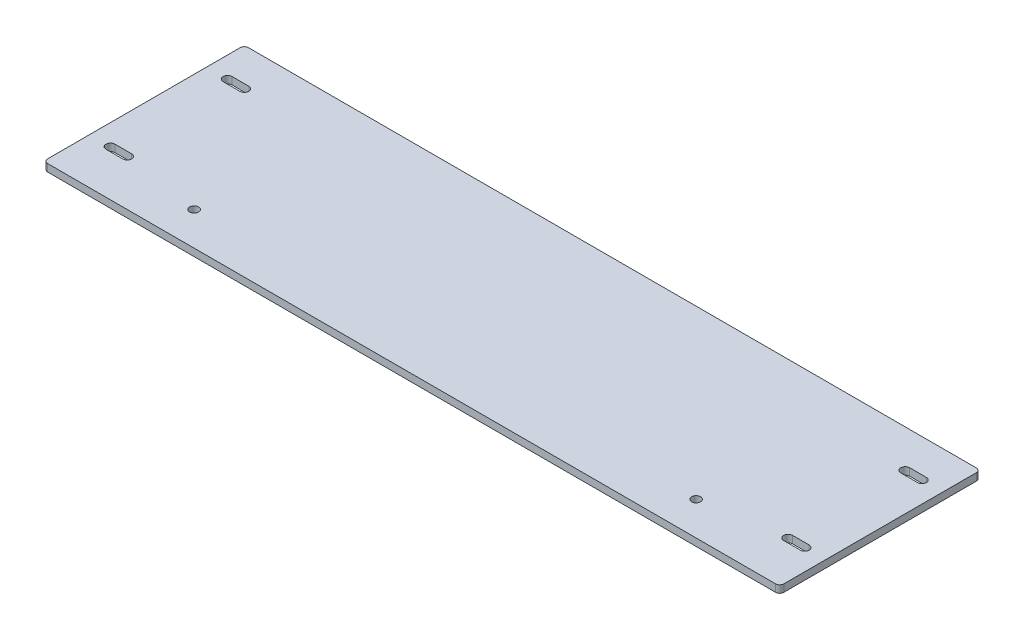
ISO-10303-21;
HEADER;
FILE_DESCRIPTION(('STEP AP214'),'2;1');
FILE_NAME('part.step','',(''),(''),'','','');
FILE_SCHEMA(('AUTOMOTIVE_DESIGN { 1 0 10303 214 1 1 1 1 }'));
ENDSEC;
DATA;
#1=APPLICATION_CONTEXT('core data for automotive mechanical design processes');
#2=APPLICATION_PROTOCOL_DEFINITION('international standard','automotive_design',2000,#1);
#3=PRODUCT_CONTEXT('',#1,'mechanical');
#4=PRODUCT('Part','Part','',(#3));
#5=PRODUCT_RELATED_PRODUCT_CATEGORY('part','',(#4));
#6=PRODUCT_DEFINITION_FORMATION('','',#4);
#7=PRODUCT_DEFINITION_CONTEXT('part definition',#1,'design');
#8=PRODUCT_DEFINITION('design','',#6,#7);
#9=PRODUCT_DEFINITION_SHAPE('','',#8);
#10=(LENGTH_UNIT() NAMED_UNIT(*) SI_UNIT(.MILLI.,.METRE.));
#11=(NAMED_UNIT(*) PLANE_ANGLE_UNIT() SI_UNIT($,.RADIAN.));
#12=(NAMED_UNIT(*) SI_UNIT($,.STERADIAN.) SOLID_ANGLE_UNIT());
#13=UNCERTAINTY_MEASURE_WITH_UNIT(LENGTH_MEASURE(1.E-05),#10,'distance_accuracy_value','');
#14=(GEOMETRIC_REPRESENTATION_CONTEXT(3) GLOBAL_UNCERTAINTY_ASSIGNED_CONTEXT((#13)) GLOBAL_UNIT_ASSIGNED_CONTEXT((#10,
#11,#12)) REPRESENTATION_CONTEXT('',''));
#15=CARTESIAN_POINT('',(0.,0.,0.));
#16=DIRECTION('',(0.,0.,1.));
#17=DIRECTION('',(1.,0.,0.));
#18=AXIS2_PLACEMENT_3D('',#15,#16,#17);
#19=CARTESIAN_POINT('',(0.,5.588,0.));
#20=DIRECTION('',(0.,-1.,0.));
#21=DIRECTION('',(0.,0.,-1.));
#22=AXIS2_PLACEMENT_3D('',#19,#20,#21);
#23=PLANE('',#22);
#24=CARTESIAN_POINT('',(88.9000000000001,5.588,-25.4));
#25=DIRECTION('',(0.,1.,0.));
#26=DIRECTION('',(0.,0.,1.));
#27=AXIS2_PLACEMENT_3D('',#24,#25,#26);
#28=CIRCLE('',#27,3.37819999999999);
#29=CARTESIAN_POINT('',(88.9000000000001,5.588,-22.0218));
#30=VERTEX_POINT('',#29);
#31=EDGE_CURVE('E851',#30,#30,#28,.T.);
#32=ORIENTED_EDGE('',*,*,#31,.F.);
#33=EDGE_LOOP('',(#32));
#34=FACE_BOUND('',#33,.T.);
#35=CARTESIAN_POINT('',(469.9,5.588,-25.4));
#36=DIRECTION('',(0.,1.,0.));
#37=DIRECTION('',(0.,0.,1.));
#38=AXIS2_PLACEMENT_3D('',#35,#36,#37);
#39=CIRCLE('',#38,3.37819999999999);
#40=CARTESIAN_POINT('',(469.9,5.588,-22.0218));
#41=VERTEX_POINT('',#40);
#42=EDGE_CURVE('E847',#41,#41,#39,.T.);
#43=ORIENTED_EDGE('',*,*,#42,.F.);
#44=EDGE_LOOP('',(#43));
#45=FACE_BOUND('',#44,.T.);
#46=CARTESIAN_POINT('',(542.925,5.588,-123.825));
#47=DIRECTION('',(0.,1.,0.));
#48=DIRECTION('',(0.,0.,1.));
#49=AXIS2_PLACEMENT_3D('',#46,#47,#48);
#50=CIRCLE('',#49,3.37819999999999);
#51=CARTESIAN_POINT('',(542.925,5.588,-120.4468));
#52=VERTEX_POINT('',#51);
#53=CARTESIAN_POINT('',(542.925,5.588,-127.2032));
#54=VERTEX_POINT('',#53);
#55=EDGE_CURVE('E257',#52,#54,#50,.T.);
#56=ORIENTED_EDGE('',*,*,#55,.F.);
#57=DIRECTION('',(1.,0.,0.));
#58=VECTOR('',#57,1.);
#59=CARTESIAN_POINT('',(542.925,5.588,-120.4468));
#60=LINE('',#59,#58);
#61=CARTESIAN_POINT('',(530.225,5.588,-120.4468));
#62=VERTEX_POINT('',#61);
#63=EDGE_CURVE('E268',#62,#52,#60,.T.);
#64=ORIENTED_EDGE('',*,*,#63,.F.);
#65=CARTESIAN_POINT('',(530.225,5.588,-123.825));
#66=DIRECTION('',(0.,1.,0.));
#67=DIRECTION('',(0.,0.,1.));
#68=AXIS2_PLACEMENT_3D('',#65,#66,#67);
#69=CIRCLE('',#68,3.37819999999999);
#70=CARTESIAN_POINT('',(530.225,5.588,-127.2032));
#71=VERTEX_POINT('',#70);
#72=EDGE_CURVE('E264',#71,#62,#69,.T.);
#73=ORIENTED_EDGE('',*,*,#72,.F.);
#74=DIRECTION('',(-1.,0.,0.));
#75=VECTOR('',#74,1.);
#76=CARTESIAN_POINT('',(542.925,5.588,-127.2032));
#77=LINE('',#76,#75);
#78=EDGE_CURVE('E260',#54,#71,#77,.T.);
#79=ORIENTED_EDGE('',*,*,#78,.F.);
#80=EDGE_LOOP('',(#56,#64,#73,#79));
#81=FACE_BOUND('',#80,.T.);
#82=CARTESIAN_POINT('',(15.875,5.588,-34.925));
#83=DIRECTION('',(0.,1.,0.));
#84=DIRECTION('',(0.,0.,1.));
#85=AXIS2_PLACEMENT_3D('',#82,#83,#84);
#86=CIRCLE('',#85,3.3782);
#87=CARTESIAN_POINT('',(15.875,5.588,-38.3032));
#88=VERTEX_POINT('',#87);
#89=CARTESIAN_POINT('',(15.875,5.588,-31.5468));
#90=VERTEX_POINT('',#89);
#91=EDGE_CURVE('E343',#88,#90,#86,.T.);
#92=ORIENTED_EDGE('',*,*,#91,.F.);
#93=DIRECTION('',(-1.,0.,0.));
#94=VECTOR('',#93,1.);
#95=CARTESIAN_POINT('',(15.875,5.588,-38.3032));
#96=LINE('',#95,#94);
#97=CARTESIAN_POINT('',(28.575,5.588,-38.3032));
#98=VERTEX_POINT('',#97);
#99=EDGE_CURVE('E354',#98,#88,#96,.T.);
#100=ORIENTED_EDGE('',*,*,#99,.F.);
#101=CARTESIAN_POINT('',(28.575,5.588,-34.925));
#102=DIRECTION('',(0.,1.,0.));
#103=DIRECTION('',(0.,0.,1.));
#104=AXIS2_PLACEMENT_3D('',#101,#102,#103);
#105=CIRCLE('',#104,3.3782);
#106=CARTESIAN_POINT('',(28.575,5.588,-31.5468));
#107=VERTEX_POINT('',#106);
#108=EDGE_CURVE('E350',#107,#98,#105,.T.);
#109=ORIENTED_EDGE('',*,*,#108,.F.);
#110=DIRECTION('',(1.,0.,0.));
#111=VECTOR('',#110,1.);
#112=CARTESIAN_POINT('',(15.875,5.588,-31.5468));
#113=LINE('',#112,#111);
#114=EDGE_CURVE('E346',#90,#107,#113,.T.);
#115=ORIENTED_EDGE('',*,*,#114,.F.);
#116=EDGE_LOOP('',(#92,#100,#109,#115));
#117=FACE_BOUND('',#116,.T.);
#118=DIRECTION('',(-1.,0.,0.));
#119=VECTOR('',#118,1.);
#120=CARTESIAN_POINT('',(0.,5.588,-152.4));
#121=LINE('',#120,#119);
#122=CARTESIAN_POINT('',(555.625,5.588,-152.4));
#123=VERTEX_POINT('',#122);
#124=CARTESIAN_POINT('',(3.175,5.588,-152.4));
#125=VERTEX_POINT('',#124);
#126=EDGE_CURVE('E397',#123,#125,#121,.T.);
#127=ORIENTED_EDGE('',*,*,#126,.T.);
#128=CARTESIAN_POINT('',(3.175,5.588,-149.225));
#129=DIRECTION('',(0.,-1.,0.));
#130=DIRECTION('',(0.,0.,-1.));
#131=AXIS2_PLACEMENT_3D('',#128,#129,#130);
#132=CIRCLE('',#131,3.175);
#133=CARTESIAN_POINT('',(0.,5.588,-149.225));
#134=VERTEX_POINT('',#133);
#135=EDGE_CURVE('E448',#125,#134,#132,.F.);
#136=ORIENTED_EDGE('',*,*,#135,.T.);
#137=DIRECTION('',(0.,0.,1.));
#138=VECTOR('',#137,1.);
#139=CARTESIAN_POINT('',(0.,5.588,0.));
#140=LINE('',#139,#138);
#141=CARTESIAN_POINT('',(0.,5.588,-3.175));
#142=VERTEX_POINT('',#141);
#143=EDGE_CURVE('E386',#134,#142,#140,.T.);
#144=ORIENTED_EDGE('',*,*,#143,.T.);
#145=CARTESIAN_POINT('',(3.175,5.588,-3.175));
#146=DIRECTION('',(0.,-1.,0.));
#147=DIRECTION('',(0.,0.,-1.));
#148=AXIS2_PLACEMENT_3D('',#145,#146,#147);
#149=CIRCLE('',#148,3.175);
#150=CARTESIAN_POINT('',(3.175,5.588,0.));
#151=VERTEX_POINT('',#150);
#152=EDGE_CURVE('E442',#142,#151,#149,.F.);
#153=ORIENTED_EDGE('',*,*,#152,.T.);
#154=DIRECTION('',(1.,0.,0.));
#155=VECTOR('',#154,1.);
#156=CARTESIAN_POINT('',(0.,5.588,0.));
#157=LINE('',#156,#155);
#158=CARTESIAN_POINT('',(555.625,5.588,0.));
#159=VERTEX_POINT('',#158);
#160=EDGE_CURVE('E390',#151,#159,#157,.T.);
#161=ORIENTED_EDGE('',*,*,#160,.T.);
#162=CARTESIAN_POINT('',(555.625,5.588,-3.175));
#163=DIRECTION('',(0.,-1.,0.));
#164=DIRECTION('',(0.,0.,-1.));
#165=AXIS2_PLACEMENT_3D('',#162,#163,#164);
#166=CIRCLE('',#165,3.175);
#167=CARTESIAN_POINT('',(558.8,5.588,-3.175));
#168=VERTEX_POINT('',#167);
#169=EDGE_CURVE('E59',#159,#168,#166,.F.);
#170=ORIENTED_EDGE('',*,*,#169,.T.);
#171=DIRECTION('',(0.,0.,-1.));
#172=VECTOR('',#171,1.);
#173=CARTESIAN_POINT('',(558.8,5.588,0.));
#174=LINE('',#173,#172);
#175=CARTESIAN_POINT('',(558.8,5.588,-149.225));
#176=VERTEX_POINT('',#175);
#177=EDGE_CURVE('E394',#168,#176,#174,.T.);
#178=ORIENTED_EDGE('',*,*,#177,.T.);
#179=CARTESIAN_POINT('',(555.625,5.588,-149.225));
#180=DIRECTION('',(0.,-1.,0.));
#181=DIRECTION('',(0.,0.,-1.));
#182=AXIS2_PLACEMENT_3D('',#179,#180,#181);
#183=CIRCLE('',#182,3.175);
#184=EDGE_CURVE('E445',#176,#123,#183,.F.);
#185=ORIENTED_EDGE('',*,*,#184,.T.);
#186=EDGE_LOOP('',(#127,#136,#144,#153,#161,#170,#178,#185));
#187=FACE_BOUND('',#186,.T.);
#188=CARTESIAN_POINT('',(15.875,5.588,-123.825));
#189=DIRECTION('',(0.,1.,0.));
#190=DIRECTION('',(0.,0.,1.));
#191=AXIS2_PLACEMENT_3D('',#188,#189,#190);
#192=CIRCLE('',#191,3.37819999999998);
#193=CARTESIAN_POINT('',(15.875,5.588,-127.2032));
#194=VERTEX_POINT('',#193);
#195=CARTESIAN_POINT('',(15.875,5.588,-120.4468));
#196=VERTEX_POINT('',#195);
#197=EDGE_CURVE('E300',#194,#196,#192,.T.);
#198=ORIENTED_EDGE('',*,*,#197,.F.);
#199=DIRECTION('',(-1.,0.,0.));
#200=VECTOR('',#199,1.);
#201=CARTESIAN_POINT('',(15.875,5.588,-127.2032));
#202=LINE('',#201,#200);
#203=CARTESIAN_POINT('',(28.575,5.588,-127.2032));
#204=VERTEX_POINT('',#203);
#205=EDGE_CURVE('E311',#204,#194,#202,.T.);
#206=ORIENTED_EDGE('',*,*,#205,.F.);
#207=CARTESIAN_POINT('',(28.575,5.588,-123.825));
#208=DIRECTION('',(0.,1.,0.));
#209=DIRECTION('',(0.,0.,1.));
#210=AXIS2_PLACEMENT_3D('',#207,#208,#209);
#211=CIRCLE('',#210,3.37819999999998);
#212=CARTESIAN_POINT('',(28.575,5.588,-120.4468));
#213=VERTEX_POINT('',#212);
#214=EDGE_CURVE('E307',#213,#204,#211,.T.);
#215=ORIENTED_EDGE('',*,*,#214,.F.);
#216=DIRECTION('',(1.,0.,0.));
#217=VECTOR('',#216,1.);
#218=CARTESIAN_POINT('',(15.875,5.588,-120.4468));
#219=LINE('',#218,#217);
#220=EDGE_CURVE('E303',#196,#213,#219,.T.);
#221=ORIENTED_EDGE('',*,*,#220,.F.);
#222=EDGE_LOOP('',(#198,#206,#215,#221));
#223=FACE_BOUND('',#222,.T.);
#224=CARTESIAN_POINT('',(542.925,5.588,-34.925));
#225=DIRECTION('',(0.,1.,0.));
#226=DIRECTION('',(0.,0.,1.));
#227=AXIS2_PLACEMENT_3D('',#224,#225,#226);
#228=CIRCLE('',#227,3.37819999999999);
#229=CARTESIAN_POINT('',(542.925,5.588,-31.5468));
#230=VERTEX_POINT('',#229);
#231=CARTESIAN_POINT('',(542.925,5.588,-38.3032));
#232=VERTEX_POINT('',#231);
#233=EDGE_CURVE('E201',#230,#232,#228,.T.);
#234=ORIENTED_EDGE('',*,*,#233,.F.);
#235=DIRECTION('',(1.,0.,0.));
#236=VECTOR('',#235,1.);
#237=CARTESIAN_POINT('',(542.925,5.588,-31.5468));
#238=LINE('',#237,#236);
#239=CARTESIAN_POINT('',(530.225,5.588,-31.5468));
#240=VERTEX_POINT('',#239);
#241=EDGE_CURVE('E231',#240,#230,#238,.T.);
#242=ORIENTED_EDGE('',*,*,#241,.F.);
#243=CARTESIAN_POINT('',(530.225,5.588,-34.925));
#244=DIRECTION('',(0.,1.,0.));
#245=DIRECTION('',(0.,0.,1.));
#246=AXIS2_PLACEMENT_3D('',#243,#244,#245);
#247=CIRCLE('',#246,3.37819999999999);
#248=CARTESIAN_POINT('',(530.225,5.588,-38.3032));
#249=VERTEX_POINT('',#248);
#250=EDGE_CURVE('E226',#249,#240,#247,.T.);
#251=ORIENTED_EDGE('',*,*,#250,.F.);
#252=DIRECTION('',(-1.,0.,0.));
#253=VECTOR('',#252,1.);
#254=CARTESIAN_POINT('',(542.925,5.588,-38.3032));
#255=LINE('',#254,#253);
#256=EDGE_CURVE('E212',#232,#249,#255,.T.);
#257=ORIENTED_EDGE('',*,*,#256,.F.);
#258=EDGE_LOOP('',(#234,#242,#251,#257));
#259=FACE_BOUND('',#258,.T.);
#260=ADVANCED_FACE('F36',(#34,#45,#81,#117,#187,#223,#259),#23,.F.);
#261=CARTESIAN_POINT('',(0.,0.,0.));
#262=DIRECTION('',(0.,-1.,0.));
#263=DIRECTION('',(0.,0.,-1.));
#264=AXIS2_PLACEMENT_3D('',#261,#262,#263);
#265=PLANE('',#264);
#266=CARTESIAN_POINT('',(88.9000000000001,0.,-25.4));
#267=DIRECTION('',(0.,1.,0.));
#268=DIRECTION('',(0.,0.,1.));
#269=AXIS2_PLACEMENT_3D('',#266,#267,#268);
#270=CIRCLE('',#269,3.37819999999999);
#271=CARTESIAN_POINT('',(88.9000000000001,0.,-22.0218));
#272=VERTEX_POINT('',#271);
#273=EDGE_CURVE('E240',#272,#272,#270,.T.);
#274=ORIENTED_EDGE('',*,*,#273,.T.);
#275=EDGE_LOOP('',(#274));
#276=FACE_BOUND('',#275,.T.);
#277=CARTESIAN_POINT('',(469.9,0.,-25.4));
#278=DIRECTION('',(0.,1.,0.));
#279=DIRECTION('',(0.,0.,1.));
#280=AXIS2_PLACEMENT_3D('',#277,#278,#279);
#281=CIRCLE('',#280,3.37819999999999);
#282=CARTESIAN_POINT('',(469.9,0.,-22.0218));
#283=VERTEX_POINT('',#282);
#284=EDGE_CURVE('E844',#283,#283,#281,.T.);
#285=ORIENTED_EDGE('',*,*,#284,.T.);
#286=EDGE_LOOP('',(#285));
#287=FACE_BOUND('',#286,.T.);
#288=DIRECTION('',(0.,0.,1.));
#289=VECTOR('',#288,1.);
#290=CARTESIAN_POINT('',(0.,0.,0.));
#291=LINE('',#290,#289);
#292=CARTESIAN_POINT('',(0.,0.,-149.225));
#293=VERTEX_POINT('',#292);
#294=CARTESIAN_POINT('',(0.,0.,-3.175));
#295=VERTEX_POINT('',#294);
#296=EDGE_CURVE('E385',#293,#295,#291,.T.);
#297=ORIENTED_EDGE('',*,*,#296,.F.);
#298=CARTESIAN_POINT('',(3.175,0.,-149.225));
#299=DIRECTION('',(0.,-1.,0.));
#300=DIRECTION('',(0.,0.,-1.));
#301=AXIS2_PLACEMENT_3D('',#298,#299,#300);
#302=CIRCLE('',#301,3.175);
#303=CARTESIAN_POINT('',(3.175,0.,-152.4));
#304=VERTEX_POINT('',#303);
#305=EDGE_CURVE('E430',#293,#304,#302,.T.);
#306=ORIENTED_EDGE('',*,*,#305,.T.);
#307=DIRECTION('',(-1.,0.,0.));
#308=VECTOR('',#307,1.);
#309=CARTESIAN_POINT('',(0.,0.,-152.4));
#310=LINE('',#309,#308);
#311=CARTESIAN_POINT('',(555.625,0.,-152.4));
#312=VERTEX_POINT('',#311);
#313=EDGE_CURVE('E391',#312,#304,#310,.T.);
#314=ORIENTED_EDGE('',*,*,#313,.F.);
#315=CARTESIAN_POINT('',(555.625,0.,-149.225));
#316=DIRECTION('',(0.,-1.,0.));
#317=DIRECTION('',(0.,0.,-1.));
#318=AXIS2_PLACEMENT_3D('',#315,#316,#317);
#319=CIRCLE('',#318,3.175);
#320=CARTESIAN_POINT('',(558.8,0.,-149.225));
#321=VERTEX_POINT('',#320);
#322=EDGE_CURVE('E427',#312,#321,#319,.T.);
#323=ORIENTED_EDGE('',*,*,#322,.T.);
#324=DIRECTION('',(0.,0.,-1.));
#325=VECTOR('',#324,1.);
#326=CARTESIAN_POINT('',(558.8,0.,0.));
#327=LINE('',#326,#325);
#328=CARTESIAN_POINT('',(558.8,0.,-3.175));
#329=VERTEX_POINT('',#328);
#330=EDGE_CURVE('E409',#329,#321,#327,.T.);
#331=ORIENTED_EDGE('',*,*,#330,.F.);
#332=CARTESIAN_POINT('',(555.625,0.,-3.175));
#333=DIRECTION('',(0.,-1.,0.));
#334=DIRECTION('',(0.,0.,-1.));
#335=AXIS2_PLACEMENT_3D('',#332,#333,#334);
#336=CIRCLE('',#335,3.175);
#337=CARTESIAN_POINT('',(555.625,0.,0.));
#338=VERTEX_POINT('',#337);
#339=EDGE_CURVE('E421',#329,#338,#336,.T.);
#340=ORIENTED_EDGE('',*,*,#339,.T.);
#341=DIRECTION('',(1.,0.,0.));
#342=VECTOR('',#341,1.);
#343=CARTESIAN_POINT('',(0.,0.,0.));
#344=LINE('',#343,#342);
#345=CARTESIAN_POINT('',(3.175,0.,0.));
#346=VERTEX_POINT('',#345);
#347=EDGE_CURVE('E405',#346,#338,#344,.T.);
#348=ORIENTED_EDGE('',*,*,#347,.F.);
#349=CARTESIAN_POINT('',(3.175,0.,-3.175));
#350=DIRECTION('',(0.,-1.,0.));
#351=DIRECTION('',(0.,0.,-1.));
#352=AXIS2_PLACEMENT_3D('',#349,#350,#351);
#353=CIRCLE('',#352,3.175);
#354=EDGE_CURVE('E424',#346,#295,#353,.T.);
#355=ORIENTED_EDGE('',*,*,#354,.T.);
#356=EDGE_LOOP('',(#297,#306,#314,#323,#331,#340,#348,#355));
#357=FACE_BOUND('',#356,.T.);
#358=DIRECTION('',(-1.,0.,0.));
#359=VECTOR('',#358,1.);
#360=CARTESIAN_POINT('',(15.875,0.,-38.3032));
#361=LINE('',#360,#359);
#362=CARTESIAN_POINT('',(28.575,0.,-38.3032));
#363=VERTEX_POINT('',#362);
#364=CARTESIAN_POINT('',(15.875,0.,-38.3032));
#365=VERTEX_POINT('',#364);
#366=EDGE_CURVE('E347',#363,#365,#361,.T.);
#367=ORIENTED_EDGE('',*,*,#366,.T.);
#368=CARTESIAN_POINT('',(15.875,0.,-34.925));
#369=DIRECTION('',(0.,1.,0.));
#370=DIRECTION('',(0.,0.,1.));
#371=AXIS2_PLACEMENT_3D('',#368,#369,#370);
#372=CIRCLE('',#371,3.3782);
#373=CARTESIAN_POINT('',(15.875,0.,-31.5468));
#374=VERTEX_POINT('',#373);
#375=EDGE_CURVE('E342',#365,#374,#372,.T.);
#376=ORIENTED_EDGE('',*,*,#375,.T.);
#377=DIRECTION('',(1.,0.,0.));
#378=VECTOR('',#377,1.);
#379=CARTESIAN_POINT('',(15.875,0.,-31.5468));
#380=LINE('',#379,#378);
#381=CARTESIAN_POINT('',(28.575,0.,-31.5468));
#382=VERTEX_POINT('',#381);
#383=EDGE_CURVE('E361',#374,#382,#380,.T.);
#384=ORIENTED_EDGE('',*,*,#383,.T.);
#385=CARTESIAN_POINT('',(28.575,0.,-34.925));
#386=DIRECTION('',(0.,1.,0.));
#387=DIRECTION('',(0.,0.,1.));
#388=AXIS2_PLACEMENT_3D('',#385,#386,#387);
#389=CIRCLE('',#388,3.3782);
#390=EDGE_CURVE('E365',#382,#363,#389,.T.);
#391=ORIENTED_EDGE('',*,*,#390,.T.);
#392=EDGE_LOOP('',(#367,#376,#384,#391));
#393=FACE_BOUND('',#392,.T.);
#394=DIRECTION('',(-1.,0.,0.));
#395=VECTOR('',#394,1.);
#396=CARTESIAN_POINT('',(15.875,0.,-127.2032));
#397=LINE('',#396,#395);
#398=CARTESIAN_POINT('',(28.575,0.,-127.2032));
#399=VERTEX_POINT('',#398);
#400=CARTESIAN_POINT('',(15.875,0.,-127.2032));
#401=VERTEX_POINT('',#400);
#402=EDGE_CURVE('E304',#399,#401,#397,.T.);
#403=ORIENTED_EDGE('',*,*,#402,.T.);
#404=CARTESIAN_POINT('',(15.875,0.,-123.825));
#405=DIRECTION('',(0.,1.,0.));
#406=DIRECTION('',(0.,0.,1.));
#407=AXIS2_PLACEMENT_3D('',#404,#405,#406);
#408=CIRCLE('',#407,3.37819999999998);
#409=CARTESIAN_POINT('',(15.875,0.,-120.4468));
#410=VERTEX_POINT('',#409);
#411=EDGE_CURVE('E299',#401,#410,#408,.T.);
#412=ORIENTED_EDGE('',*,*,#411,.T.);
#413=DIRECTION('',(1.,0.,0.));
#414=VECTOR('',#413,1.);
#415=CARTESIAN_POINT('',(15.875,0.,-120.4468));
#416=LINE('',#415,#414);
#417=CARTESIAN_POINT('',(28.575,0.,-120.4468));
#418=VERTEX_POINT('',#417);
#419=EDGE_CURVE('E318',#410,#418,#416,.T.);
#420=ORIENTED_EDGE('',*,*,#419,.T.);
#421=CARTESIAN_POINT('',(28.575,0.,-123.825));
#422=DIRECTION('',(0.,1.,0.));
#423=DIRECTION('',(0.,0.,1.));
#424=AXIS2_PLACEMENT_3D('',#421,#422,#423);
#425=CIRCLE('',#424,3.37819999999998);
#426=EDGE_CURVE('E322',#418,#399,#425,.T.);
#427=ORIENTED_EDGE('',*,*,#426,.T.);
#428=EDGE_LOOP('',(#403,#412,#420,#427));
#429=FACE_BOUND('',#428,.T.);
#430=DIRECTION('',(1.,0.,0.));
#431=VECTOR('',#430,1.);
#432=CARTESIAN_POINT('',(542.925,0.,-120.4468));
#433=LINE('',#432,#431);
#434=CARTESIAN_POINT('',(530.225,0.,-120.4468));
#435=VERTEX_POINT('',#434);
#436=CARTESIAN_POINT('',(542.925,0.,-120.4468));
#437=VERTEX_POINT('',#436);
#438=EDGE_CURVE('E261',#435,#437,#433,.T.);
#439=ORIENTED_EDGE('',*,*,#438,.T.);
#440=CARTESIAN_POINT('',(542.925,0.,-123.825));
#441=DIRECTION('',(0.,1.,0.));
#442=DIRECTION('',(0.,0.,1.));
#443=AXIS2_PLACEMENT_3D('',#440,#441,#442);
#444=CIRCLE('',#443,3.37819999999999);
#445=CARTESIAN_POINT('',(542.925,0.,-127.2032));
#446=VERTEX_POINT('',#445);
#447=EDGE_CURVE('E221',#437,#446,#444,.T.);
#448=ORIENTED_EDGE('',*,*,#447,.T.);
#449=DIRECTION('',(-1.,0.,0.));
#450=VECTOR('',#449,1.);
#451=CARTESIAN_POINT('',(542.925,0.,-127.2032));
#452=LINE('',#451,#450);
#453=CARTESIAN_POINT('',(530.225,0.,-127.2032));
#454=VERTEX_POINT('',#453);
#455=EDGE_CURVE('E275',#446,#454,#452,.T.);
#456=ORIENTED_EDGE('',*,*,#455,.T.);
#457=CARTESIAN_POINT('',(530.225,0.,-123.825));
#458=DIRECTION('',(0.,1.,0.));
#459=DIRECTION('',(0.,0.,1.));
#460=AXIS2_PLACEMENT_3D('',#457,#458,#459);
#461=CIRCLE('',#460,3.37819999999999);
#462=EDGE_CURVE('E279',#454,#435,#461,.T.);
#463=ORIENTED_EDGE('',*,*,#462,.T.);
#464=EDGE_LOOP('',(#439,#448,#456,#463));
#465=FACE_BOUND('',#464,.T.);
#466=DIRECTION('',(1.,0.,0.));
#467=VECTOR('',#466,1.);
#468=CARTESIAN_POINT('',(542.925,0.,-31.5468));
#469=LINE('',#468,#467);
#470=CARTESIAN_POINT('',(530.225,0.,-31.5468));
#471=VERTEX_POINT('',#470);
#472=CARTESIAN_POINT('',(542.925,0.,-31.5468));
#473=VERTEX_POINT('',#472);
#474=EDGE_CURVE('E213',#471,#473,#469,.T.);
#475=ORIENTED_EDGE('',*,*,#474,.T.);
#476=CARTESIAN_POINT('',(542.925,0.,-34.925));
#477=DIRECTION('',(0.,1.,0.));
#478=DIRECTION('',(0.,0.,1.));
#479=AXIS2_PLACEMENT_3D('',#476,#477,#478);
#480=CIRCLE('',#479,3.37819999999999);
#481=CARTESIAN_POINT('',(542.925,0.,-38.3032));
#482=VERTEX_POINT('',#481);
#483=EDGE_CURVE('E237',#473,#482,#480,.T.);
#484=ORIENTED_EDGE('',*,*,#483,.T.);
#485=DIRECTION('',(-1.,0.,0.));
#486=VECTOR('',#485,1.);
#487=CARTESIAN_POINT('',(542.925,0.,-38.3032));
#488=LINE('',#487,#486);
#489=CARTESIAN_POINT('',(530.225,0.,-38.3032));
#490=VERTEX_POINT('',#489);
#491=EDGE_CURVE('E219',#482,#490,#488,.T.);
#492=ORIENTED_EDGE('',*,*,#491,.T.);
#493=CARTESIAN_POINT('',(530.225,0.,-34.925));
#494=DIRECTION('',(0.,1.,0.));
#495=DIRECTION('',(0.,0.,1.));
#496=AXIS2_PLACEMENT_3D('',#493,#494,#495);
#497=CIRCLE('',#496,3.37819999999999);
#498=EDGE_CURVE('E243',#490,#471,#497,.T.);
#499=ORIENTED_EDGE('',*,*,#498,.T.);
#500=EDGE_LOOP('',(#475,#484,#492,#499));
#501=FACE_BOUND('',#500,.T.);
#502=ADVANCED_FACE('F472',(#276,#287,#357,#393,#429,#465,#501),#265,.T.);
#503=CARTESIAN_POINT('',(0.,5.588,0.));
#504=DIRECTION('',(1.,0.,0.));
#505=DIRECTION('',(0.,0.,-1.));
#506=AXIS2_PLACEMENT_3D('',#503,#504,#505);
#507=PLANE('',#506);
#508=ORIENTED_EDGE('',*,*,#143,.F.);
#509=DIRECTION('',(0.,-1.,0.));
#510=VECTOR('',#509,1.);
#511=CARTESIAN_POINT('',(0.,5.588,-149.225));
#512=LINE('',#511,#510);
#513=EDGE_CURVE('E417',#134,#293,#512,.T.);
#514=ORIENTED_EDGE('',*,*,#513,.T.);
#515=ORIENTED_EDGE('',*,*,#296,.T.);
#516=DIRECTION('',(0.,-1.,0.));
#517=VECTOR('',#516,1.);
#518=CARTESIAN_POINT('',(0.,5.588,-3.175));
#519=LINE('',#518,#517);
#520=EDGE_CURVE('E401',#295,#142,#519,.F.);
#521=ORIENTED_EDGE('',*,*,#520,.T.);
#522=EDGE_LOOP('',(#508,#514,#515,#521));
#523=FACE_BOUND('',#522,.T.);
#524=ADVANCED_FACE('F489',(#523),#507,.F.);
#525=CARTESIAN_POINT('',(0.,5.588,0.));
#526=DIRECTION('',(0.,0.,-1.));
#527=DIRECTION('',(-1.,0.,0.));
#528=AXIS2_PLACEMENT_3D('',#525,#526,#527);
#529=PLANE('',#528);
#530=ORIENTED_EDGE('',*,*,#160,.F.);
#531=DIRECTION('',(0.,-1.,0.));
#532=VECTOR('',#531,1.);
#533=CARTESIAN_POINT('',(3.175,5.588,0.));
#534=LINE('',#533,#532);
#535=EDGE_CURVE('E11',#151,#346,#534,.T.);
#536=ORIENTED_EDGE('',*,*,#535,.T.);
#537=ORIENTED_EDGE('',*,*,#347,.T.);
#538=DIRECTION('',(0.,-1.,0.));
#539=VECTOR('',#538,1.);
#540=CARTESIAN_POINT('',(555.625,5.588,0.));
#541=LINE('',#540,#539);
#542=EDGE_CURVE('E45',#338,#159,#541,.F.);
#543=ORIENTED_EDGE('',*,*,#542,.T.);
#544=EDGE_LOOP('',(#530,#536,#537,#543));
#545=FACE_BOUND('',#544,.T.);
#546=ADVANCED_FACE('F461',(#545),#529,.F.);
#547=CARTESIAN_POINT('',(558.8,5.588,0.));
#548=DIRECTION('',(-1.,0.,0.));
#549=DIRECTION('',(0.,0.,1.));
#550=AXIS2_PLACEMENT_3D('',#547,#548,#549);
#551=PLANE('',#550);
#552=ORIENTED_EDGE('',*,*,#330,.T.);
#553=DIRECTION('',(0.,-1.,0.));
#554=VECTOR('',#553,1.);
#555=CARTESIAN_POINT('',(558.8,5.588,-149.225));
#556=LINE('',#555,#554);
#557=EDGE_CURVE('E52',#321,#176,#556,.F.);
#558=ORIENTED_EDGE('',*,*,#557,.T.);
#559=ORIENTED_EDGE('',*,*,#177,.F.);
#560=DIRECTION('',(0.,-1.,0.));
#561=VECTOR('',#560,1.);
#562=CARTESIAN_POINT('',(558.8,5.588,-3.175));
#563=LINE('',#562,#561);
#564=EDGE_CURVE('E451',#168,#329,#563,.T.);
#565=ORIENTED_EDGE('',*,*,#564,.T.);
#566=EDGE_LOOP('',(#552,#558,#559,#565));
#567=FACE_BOUND('',#566,.T.);
#568=ADVANCED_FACE('F469',(#567),#551,.F.);
#569=CARTESIAN_POINT('',(0.,5.588,-152.4));
#570=DIRECTION('',(0.,0.,1.));
#571=DIRECTION('',(1.,0.,0.));
#572=AXIS2_PLACEMENT_3D('',#569,#570,#571);
#573=PLANE('',#572);
#574=ORIENTED_EDGE('',*,*,#313,.T.);
#575=DIRECTION('',(0.,-1.,0.));
#576=VECTOR('',#575,1.);
#577=CARTESIAN_POINT('',(3.175,5.588,-152.4));
#578=LINE('',#577,#576);
#579=EDGE_CURVE('E437',#304,#125,#578,.F.);
#580=ORIENTED_EDGE('',*,*,#579,.T.);
#581=ORIENTED_EDGE('',*,*,#126,.F.);
#582=DIRECTION('',(0.,-1.,0.));
#583=VECTOR('',#582,1.);
#584=CARTESIAN_POINT('',(555.625,5.588,-152.4));
#585=LINE('',#584,#583);
#586=EDGE_CURVE('E433',#123,#312,#585,.T.);
#587=ORIENTED_EDGE('',*,*,#586,.T.);
#588=EDGE_LOOP('',(#574,#580,#581,#587));
#589=FACE_BOUND('',#588,.T.);
#590=ADVANCED_FACE('F481',(#589),#573,.F.);
#591=CARTESIAN_POINT('',(15.875,5.588,-34.925));
#592=DIRECTION('',(0.,-1.,0.));
#593=DIRECTION('',(0.,0.,-1.));
#594=AXIS2_PLACEMENT_3D('',#591,#592,#593);
#595=CYLINDRICAL_SURFACE('',#594,3.3782);
#596=ORIENTED_EDGE('',*,*,#375,.F.);
#597=DIRECTION('',(0.,-1.,0.));
#598=VECTOR('',#597,1.);
#599=CARTESIAN_POINT('',(15.875,5.588,-38.3032));
#600=LINE('',#599,#598);
#601=EDGE_CURVE('E357',#88,#365,#600,.T.);
#602=ORIENTED_EDGE('',*,*,#601,.F.);
#603=ORIENTED_EDGE('',*,*,#91,.T.);
#604=DIRECTION('',(0.,-1.,0.));
#605=VECTOR('',#604,1.);
#606=CARTESIAN_POINT('',(15.875,5.588,-31.5468));
#607=LINE('',#606,#605);
#608=EDGE_CURVE('E381',#90,#374,#607,.T.);
#609=ORIENTED_EDGE('',*,*,#608,.T.);
#610=EDGE_LOOP('',(#596,#602,#603,#609));
#611=FACE_BOUND('',#610,.T.);
#612=ADVANCED_FACE('F511',(#611),#595,.F.);
#613=CARTESIAN_POINT('',(15.875,5.588,-31.5468));
#614=DIRECTION('',(0.,0.,-1.));
#615=DIRECTION('',(-1.,0.,0.));
#616=AXIS2_PLACEMENT_3D('',#613,#614,#615);
#617=PLANE('',#616);
#618=ORIENTED_EDGE('',*,*,#383,.F.);
#619=ORIENTED_EDGE('',*,*,#608,.F.);
#620=ORIENTED_EDGE('',*,*,#114,.T.);
#621=DIRECTION('',(0.,-1.,0.));
#622=VECTOR('',#621,1.);
#623=CARTESIAN_POINT('',(28.575,5.588,-31.5468));
#624=LINE('',#623,#622);
#625=EDGE_CURVE('E378',#107,#382,#624,.T.);
#626=ORIENTED_EDGE('',*,*,#625,.T.);
#627=EDGE_LOOP('',(#618,#619,#620,#626));
#628=FACE_BOUND('',#627,.T.);
#629=ADVANCED_FACE('F581',(#628),#617,.T.);
#630=CARTESIAN_POINT('',(28.575,5.588,-34.925));
#631=DIRECTION('',(0.,-1.,0.));
#632=DIRECTION('',(0.,0.,-1.));
#633=AXIS2_PLACEMENT_3D('',#630,#631,#632);
#634=CYLINDRICAL_SURFACE('',#633,3.3782);
#635=ORIENTED_EDGE('',*,*,#390,.F.);
#636=ORIENTED_EDGE('',*,*,#625,.F.);
#637=ORIENTED_EDGE('',*,*,#108,.T.);
#638=DIRECTION('',(0.,-1.,0.));
#639=VECTOR('',#638,1.);
#640=CARTESIAN_POINT('',(28.575,5.588,-38.3032));
#641=LINE('',#640,#639);
#642=EDGE_CURVE('E375',#98,#363,#641,.T.);
#643=ORIENTED_EDGE('',*,*,#642,.T.);
#644=EDGE_LOOP('',(#635,#636,#637,#643));
#645=FACE_BOUND('',#644,.T.);
#646=ADVANCED_FACE('F578',(#645),#634,.F.);
#647=CARTESIAN_POINT('',(15.875,5.588,-38.3032));
#648=DIRECTION('',(0.,0.,1.));
#649=DIRECTION('',(1.,0.,0.));
#650=AXIS2_PLACEMENT_3D('',#647,#648,#649);
#651=PLANE('',#650);
#652=ORIENTED_EDGE('',*,*,#366,.F.);
#653=ORIENTED_EDGE('',*,*,#642,.F.);
#654=ORIENTED_EDGE('',*,*,#99,.T.);
#655=ORIENTED_EDGE('',*,*,#601,.T.);
#656=EDGE_LOOP('',(#652,#653,#654,#655));
#657=FACE_BOUND('',#656,.T.);
#658=ADVANCED_FACE('F574',(#657),#651,.T.);
#659=CARTESIAN_POINT('',(15.875,5.588,-123.825));
#660=DIRECTION('',(0.,-1.,0.));
#661=DIRECTION('',(0.,0.,-1.));
#662=AXIS2_PLACEMENT_3D('',#659,#660,#661);
#663=CYLINDRICAL_SURFACE('',#662,3.37819999999998);
#664=ORIENTED_EDGE('',*,*,#411,.F.);
#665=DIRECTION('',(0.,-1.,0.));
#666=VECTOR('',#665,1.);
#667=CARTESIAN_POINT('',(15.875,5.588,-127.2032));
#668=LINE('',#667,#666);
#669=EDGE_CURVE('E314',#194,#401,#668,.T.);
#670=ORIENTED_EDGE('',*,*,#669,.F.);
#671=ORIENTED_EDGE('',*,*,#197,.T.);
#672=DIRECTION('',(0.,-1.,0.));
#673=VECTOR('',#672,1.);
#674=CARTESIAN_POINT('',(15.875,5.588,-120.4468));
#675=LINE('',#674,#673);
#676=EDGE_CURVE('E338',#196,#410,#675,.T.);
#677=ORIENTED_EDGE('',*,*,#676,.T.);
#678=EDGE_LOOP('',(#664,#670,#671,#677));
#679=FACE_BOUND('',#678,.T.);
#680=ADVANCED_FACE('F570',(#679),#663,.F.);
#681=CARTESIAN_POINT('',(15.875,5.588,-120.4468));
#682=DIRECTION('',(0.,0.,-1.));
#683=DIRECTION('',(-1.,0.,0.));
#684=AXIS2_PLACEMENT_3D('',#681,#682,#683);
#685=PLANE('',#684);
#686=ORIENTED_EDGE('',*,*,#419,.F.);
#687=ORIENTED_EDGE('',*,*,#676,.F.);
#688=ORIENTED_EDGE('',*,*,#220,.T.);
#689=DIRECTION('',(0.,-1.,0.));
#690=VECTOR('',#689,1.);
#691=CARTESIAN_POINT('',(28.575,5.588,-120.4468));
#692=LINE('',#691,#690);
#693=EDGE_CURVE('E335',#213,#418,#692,.T.);
#694=ORIENTED_EDGE('',*,*,#693,.T.);
#695=EDGE_LOOP('',(#686,#687,#688,#694));
#696=FACE_BOUND('',#695,.T.);
#697=ADVANCED_FACE('F566',(#696),#685,.T.);
#698=CARTESIAN_POINT('',(28.575,5.588,-123.825));
#699=DIRECTION('',(0.,-1.,0.));
#700=DIRECTION('',(0.,0.,-1.));
#701=AXIS2_PLACEMENT_3D('',#698,#699,#700);
#702=CYLINDRICAL_SURFACE('',#701,3.37819999999998);
#703=ORIENTED_EDGE('',*,*,#426,.F.);
#704=ORIENTED_EDGE('',*,*,#693,.F.);
#705=ORIENTED_EDGE('',*,*,#214,.T.);
#706=DIRECTION('',(0.,-1.,0.));
#707=VECTOR('',#706,1.);
#708=CARTESIAN_POINT('',(28.575,5.588,-127.2032));
#709=LINE('',#708,#707);
#710=EDGE_CURVE('E332',#204,#399,#709,.T.);
#711=ORIENTED_EDGE('',*,*,#710,.T.);
#712=EDGE_LOOP('',(#703,#704,#705,#711));
#713=FACE_BOUND('',#712,.T.);
#714=ADVANCED_FACE('F562',(#713),#702,.F.);
#715=CARTESIAN_POINT('',(15.875,5.588,-127.2032));
#716=DIRECTION('',(0.,0.,1.));
#717=DIRECTION('',(1.,0.,0.));
#718=AXIS2_PLACEMENT_3D('',#715,#716,#717);
#719=PLANE('',#718);
#720=ORIENTED_EDGE('',*,*,#402,.F.);
#721=ORIENTED_EDGE('',*,*,#710,.F.);
#722=ORIENTED_EDGE('',*,*,#205,.T.);
#723=ORIENTED_EDGE('',*,*,#669,.T.);
#724=EDGE_LOOP('',(#720,#721,#722,#723));
#725=FACE_BOUND('',#724,.T.);
#726=ADVANCED_FACE('F558',(#725),#719,.T.);
#727=CARTESIAN_POINT('',(542.925,5.588,-123.825));
#728=DIRECTION('',(0.,-1.,0.));
#729=DIRECTION('',(0.,0.,-1.));
#730=AXIS2_PLACEMENT_3D('',#727,#728,#729);
#731=CYLINDRICAL_SURFACE('',#730,3.37819999999999);
#732=ORIENTED_EDGE('',*,*,#447,.F.);
#733=DIRECTION('',(0.,-1.,0.));
#734=VECTOR('',#733,1.);
#735=CARTESIAN_POINT('',(542.925,5.588,-120.4468));
#736=LINE('',#735,#734);
#737=EDGE_CURVE('E271',#52,#437,#736,.T.);
#738=ORIENTED_EDGE('',*,*,#737,.F.);
#739=ORIENTED_EDGE('',*,*,#55,.T.);
#740=DIRECTION('',(0.,-1.,0.));
#741=VECTOR('',#740,1.);
#742=CARTESIAN_POINT('',(542.925,5.588,-127.2032));
#743=LINE('',#742,#741);
#744=EDGE_CURVE('E295',#54,#446,#743,.T.);
#745=ORIENTED_EDGE('',*,*,#744,.T.);
#746=EDGE_LOOP('',(#732,#738,#739,#745));
#747=FACE_BOUND('',#746,.T.);
#748=ADVANCED_FACE('F554',(#747),#731,.F.);
#749=CARTESIAN_POINT('',(542.925,5.588,-127.2032));
#750=DIRECTION('',(0.,0.,1.));
#751=DIRECTION('',(1.,0.,0.));
#752=AXIS2_PLACEMENT_3D('',#749,#750,#751);
#753=PLANE('',#752);
#754=ORIENTED_EDGE('',*,*,#455,.F.);
#755=ORIENTED_EDGE('',*,*,#744,.F.);
#756=ORIENTED_EDGE('',*,*,#78,.T.);
#757=DIRECTION('',(0.,-1.,0.));
#758=VECTOR('',#757,1.);
#759=CARTESIAN_POINT('',(530.225,5.588,-127.2032));
#760=LINE('',#759,#758);
#761=EDGE_CURVE('E292',#71,#454,#760,.T.);
#762=ORIENTED_EDGE('',*,*,#761,.T.);
#763=EDGE_LOOP('',(#754,#755,#756,#762));
#764=FACE_BOUND('',#763,.T.);
#765=ADVANCED_FACE('F550',(#764),#753,.T.);
#766=CARTESIAN_POINT('',(530.225,5.588,-123.825));
#767=DIRECTION('',(0.,-1.,0.));
#768=DIRECTION('',(0.,0.,-1.));
#769=AXIS2_PLACEMENT_3D('',#766,#767,#768);
#770=CYLINDRICAL_SURFACE('',#769,3.37819999999999);
#771=ORIENTED_EDGE('',*,*,#462,.F.);
#772=ORIENTED_EDGE('',*,*,#761,.F.);
#773=ORIENTED_EDGE('',*,*,#72,.T.);
#774=DIRECTION('',(0.,-1.,0.));
#775=VECTOR('',#774,1.);
#776=CARTESIAN_POINT('',(530.225,5.588,-120.4468));
#777=LINE('',#776,#775);
#778=EDGE_CURVE('E289',#62,#435,#777,.T.);
#779=ORIENTED_EDGE('',*,*,#778,.T.);
#780=EDGE_LOOP('',(#771,#772,#773,#779));
#781=FACE_BOUND('',#780,.T.);
#782=ADVANCED_FACE('F546',(#781),#770,.F.);
#783=CARTESIAN_POINT('',(542.925,5.588,-120.4468));
#784=DIRECTION('',(0.,0.,-1.));
#785=DIRECTION('',(-1.,0.,0.));
#786=AXIS2_PLACEMENT_3D('',#783,#784,#785);
#787=PLANE('',#786);
#788=ORIENTED_EDGE('',*,*,#438,.F.);
#789=ORIENTED_EDGE('',*,*,#778,.F.);
#790=ORIENTED_EDGE('',*,*,#63,.T.);
#791=ORIENTED_EDGE('',*,*,#737,.T.);
#792=EDGE_LOOP('',(#788,#789,#790,#791));
#793=FACE_BOUND('',#792,.T.);
#794=ADVANCED_FACE('F543',(#793),#787,.T.);
#795=CARTESIAN_POINT('',(542.925,5.588,-34.925));
#796=DIRECTION('',(0.,-1.,0.));
#797=DIRECTION('',(0.,0.,-1.));
#798=AXIS2_PLACEMENT_3D('',#795,#796,#797);
#799=CYLINDRICAL_SURFACE('',#798,3.37819999999999);
#800=ORIENTED_EDGE('',*,*,#483,.F.);
#801=DIRECTION('',(0.,-1.,0.));
#802=VECTOR('',#801,1.);
#803=CARTESIAN_POINT('',(542.925,5.588,-31.5468));
#804=LINE('',#803,#802);
#805=EDGE_CURVE('E207',#230,#473,#804,.T.);
#806=ORIENTED_EDGE('',*,*,#805,.F.);
#807=ORIENTED_EDGE('',*,*,#233,.T.);
#808=DIRECTION('',(0.,-1.,0.));
#809=VECTOR('',#808,1.);
#810=CARTESIAN_POINT('',(542.925,5.588,-38.3032));
#811=LINE('',#810,#809);
#812=EDGE_CURVE('E204',#232,#482,#811,.T.);
#813=ORIENTED_EDGE('',*,*,#812,.T.);
#814=EDGE_LOOP('',(#800,#806,#807,#813));
#815=FACE_BOUND('',#814,.T.);
#816=ADVANCED_FACE('F203',(#815),#799,.F.);
#817=CARTESIAN_POINT('',(542.925,5.588,-38.3032));
#818=DIRECTION('',(0.,0.,1.));
#819=DIRECTION('',(1.,0.,0.));
#820=AXIS2_PLACEMENT_3D('',#817,#818,#819);
#821=PLANE('',#820);
#822=ORIENTED_EDGE('',*,*,#491,.F.);
#823=ORIENTED_EDGE('',*,*,#812,.F.);
#824=ORIENTED_EDGE('',*,*,#256,.T.);
#825=DIRECTION('',(0.,-1.,0.));
#826=VECTOR('',#825,1.);
#827=CARTESIAN_POINT('',(530.225,5.588,-38.3032));
#828=LINE('',#827,#826);
#829=EDGE_CURVE('E222',#249,#490,#828,.T.);
#830=ORIENTED_EDGE('',*,*,#829,.T.);
#831=EDGE_LOOP('',(#822,#823,#824,#830));
#832=FACE_BOUND('',#831,.T.);
#833=ADVANCED_FACE('F216',(#832),#821,.T.);
#834=CARTESIAN_POINT('',(530.225,5.588,-34.925));
#835=DIRECTION('',(0.,-1.,0.));
#836=DIRECTION('',(0.,0.,-1.));
#837=AXIS2_PLACEMENT_3D('',#834,#835,#836);
#838=CYLINDRICAL_SURFACE('',#837,3.37819999999999);
#839=ORIENTED_EDGE('',*,*,#498,.F.);
#840=ORIENTED_EDGE('',*,*,#829,.F.);
#841=ORIENTED_EDGE('',*,*,#250,.T.);
#842=DIRECTION('',(0.,-1.,0.));
#843=VECTOR('',#842,1.);
#844=CARTESIAN_POINT('',(530.225,5.588,-31.5468));
#845=LINE('',#844,#843);
#846=EDGE_CURVE('E252',#240,#471,#845,.T.);
#847=ORIENTED_EDGE('',*,*,#846,.T.);
#848=EDGE_LOOP('',(#839,#840,#841,#847));
#849=FACE_BOUND('',#848,.T.);
#850=ADVANCED_FACE('F527',(#849),#838,.F.);
#851=CARTESIAN_POINT('',(542.925,5.588,-31.5468));
#852=DIRECTION('',(0.,0.,-1.));
#853=DIRECTION('',(-1.,0.,0.));
#854=AXIS2_PLACEMENT_3D('',#851,#852,#853);
#855=PLANE('',#854);
#856=ORIENTED_EDGE('',*,*,#474,.F.);
#857=ORIENTED_EDGE('',*,*,#846,.F.);
#858=ORIENTED_EDGE('',*,*,#241,.T.);
#859=ORIENTED_EDGE('',*,*,#805,.T.);
#860=EDGE_LOOP('',(#856,#857,#858,#859));
#861=FACE_BOUND('',#860,.T.);
#862=ADVANCED_FACE('F523',(#861),#855,.T.);
#863=CARTESIAN_POINT('',(3.175,5.588,-149.225));
#864=DIRECTION('',(0.,-1.,0.));
#865=DIRECTION('',(0.,0.,-1.));
#866=AXIS2_PLACEMENT_3D('',#863,#864,#865);
#867=CYLINDRICAL_SURFACE('',#866,3.175);
#868=ORIENTED_EDGE('',*,*,#135,.F.);
#869=ORIENTED_EDGE('',*,*,#579,.F.);
#870=ORIENTED_EDGE('',*,*,#305,.F.);
#871=ORIENTED_EDGE('',*,*,#513,.F.);
#872=EDGE_LOOP('',(#868,#869,#870,#871));
#873=FACE_BOUND('',#872,.T.);
#874=ADVANCED_FACE('F487',(#873),#867,.T.);
#875=CARTESIAN_POINT('',(555.625,5.588,-149.225));
#876=DIRECTION('',(0.,-1.,0.));
#877=DIRECTION('',(0.,0.,-1.));
#878=AXIS2_PLACEMENT_3D('',#875,#876,#877);
#879=CYLINDRICAL_SURFACE('',#878,3.175);
#880=ORIENTED_EDGE('',*,*,#184,.F.);
#881=ORIENTED_EDGE('',*,*,#557,.F.);
#882=ORIENTED_EDGE('',*,*,#322,.F.);
#883=ORIENTED_EDGE('',*,*,#586,.F.);
#884=EDGE_LOOP('',(#880,#881,#882,#883));
#885=FACE_BOUND('',#884,.T.);
#886=ADVANCED_FACE('F478',(#885),#879,.T.);
#887=CARTESIAN_POINT('',(3.175,5.588,-3.175));
#888=DIRECTION('',(0.,-1.,0.));
#889=DIRECTION('',(0.,0.,-1.));
#890=AXIS2_PLACEMENT_3D('',#887,#888,#889);
#891=CYLINDRICAL_SURFACE('',#890,3.175);
#892=ORIENTED_EDGE('',*,*,#152,.F.);
#893=ORIENTED_EDGE('',*,*,#520,.F.);
#894=ORIENTED_EDGE('',*,*,#354,.F.);
#895=ORIENTED_EDGE('',*,*,#535,.F.);
#896=EDGE_LOOP('',(#892,#893,#894,#895));
#897=FACE_BOUND('',#896,.T.);
#898=ADVANCED_FACE('F492',(#897),#891,.T.);
#899=CARTESIAN_POINT('',(555.625,5.588,-3.175));
#900=DIRECTION('',(0.,-1.,0.));
#901=DIRECTION('',(0.,0.,-1.));
#902=AXIS2_PLACEMENT_3D('',#899,#900,#901);
#903=CYLINDRICAL_SURFACE('',#902,3.175);
#904=ORIENTED_EDGE('',*,*,#169,.F.);
#905=ORIENTED_EDGE('',*,*,#542,.F.);
#906=ORIENTED_EDGE('',*,*,#339,.F.);
#907=ORIENTED_EDGE('',*,*,#564,.F.);
#908=EDGE_LOOP('',(#904,#905,#906,#907));
#909=FACE_BOUND('',#908,.T.);
#910=ADVANCED_FACE('F38',(#909),#903,.T.);
#911=CARTESIAN_POINT('',(469.9,0.,-25.4));
#912=DIRECTION('',(0.,1.,0.));
#913=DIRECTION('',(0.,0.,1.));
#914=AXIS2_PLACEMENT_3D('',#911,#912,#913);
#915=CYLINDRICAL_SURFACE('',#914,3.37819999999999);
#916=ORIENTED_EDGE('',*,*,#284,.F.);
#917=EDGE_LOOP('',(#916));
#918=FACE_BOUND('',#917,.T.);
#919=ORIENTED_EDGE('',*,*,#42,.T.);
#920=EDGE_LOOP('',(#919));
#921=FACE_BOUND('',#920,.T.);
#922=ADVANCED_FACE('F498',(#918,#921),#915,.F.);
#923=CARTESIAN_POINT('',(88.9000000000001,0.,-25.4));
#924=DIRECTION('',(0.,1.,0.));
#925=DIRECTION('',(0.,0.,1.));
#926=AXIS2_PLACEMENT_3D('',#923,#924,#925);
#927=CYLINDRICAL_SURFACE('',#926,3.37819999999999);
#928=ORIENTED_EDGE('',*,*,#273,.F.);
#929=EDGE_LOOP('',(#928));
#930=FACE_BOUND('',#929,.T.);
#931=ORIENTED_EDGE('',*,*,#31,.T.);
#932=EDGE_LOOP('',(#931));
#933=FACE_BOUND('',#932,.T.);
#934=ADVANCED_FACE('F824',(#930,#933),#927,.F.);
#935=CLOSED_SHELL('',(#260,#502,#524,#546,#568,#590,#612,#629,#646,#658,#680,#697,#714,#726,
#748,#765,#782,#794,#816,#833,#850,#862,#874,#886,#898,#910,#922,#934));
#936=MANIFOLD_SOLID_BREP('B2',#935);
#937=ADVANCED_BREP_SHAPE_REPRESENTATION('',(#18,#936),#14);
#938=SHAPE_DEFINITION_REPRESENTATION(#9,#937);
ENDSEC;
END-ISO-10303-21;
